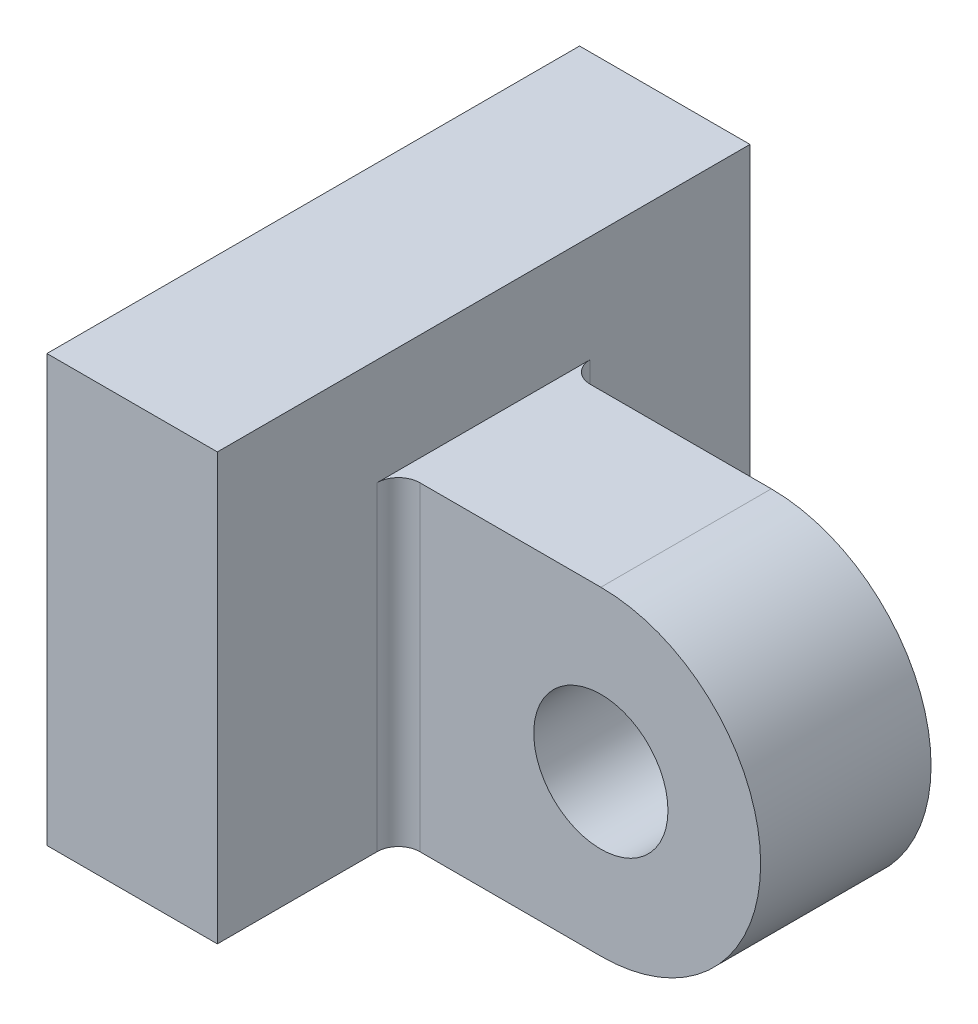
ISO-10303-21;
HEADER;
FILE_DESCRIPTION(('STEP AP214'),'2;1');
FILE_NAME('part.step','',(''),(''),'','','');
FILE_SCHEMA(('AUTOMOTIVE_DESIGN { 1 0 10303 214 1 1 1 1 }'));
ENDSEC;
DATA;
#1=APPLICATION_CONTEXT('core data for automotive mechanical design processes');
#2=APPLICATION_PROTOCOL_DEFINITION('international standard','automotive_design',2000,#1);
#3=PRODUCT_CONTEXT('',#1,'mechanical');
#4=PRODUCT('Part','Part','',(#3));
#5=PRODUCT_RELATED_PRODUCT_CATEGORY('part','',(#4));
#6=PRODUCT_DEFINITION_FORMATION('','',#4);
#7=PRODUCT_DEFINITION_CONTEXT('part definition',#1,'design');
#8=PRODUCT_DEFINITION('design','',#6,#7);
#9=PRODUCT_DEFINITION_SHAPE('','',#8);
#10=(LENGTH_UNIT() NAMED_UNIT(*) SI_UNIT(.MILLI.,.METRE.));
#11=(NAMED_UNIT(*) PLANE_ANGLE_UNIT() SI_UNIT($,.RADIAN.));
#12=(NAMED_UNIT(*) SI_UNIT($,.STERADIAN.) SOLID_ANGLE_UNIT());
#13=UNCERTAINTY_MEASURE_WITH_UNIT(LENGTH_MEASURE(1.E-05),#10,'distance_accuracy_value','');
#14=(GEOMETRIC_REPRESENTATION_CONTEXT(3) GLOBAL_UNCERTAINTY_ASSIGNED_CONTEXT((#13)) GLOBAL_UNIT_ASSIGNED_CONTEXT((#10,
#11,#12)) REPRESENTATION_CONTEXT('',''));
#15=CARTESIAN_POINT('',(0.,0.,0.));
#16=DIRECTION('',(0.,0.,1.));
#17=DIRECTION('',(1.,0.,0.));
#18=AXIS2_PLACEMENT_3D('',#15,#16,#17);
#19=CARTESIAN_POINT('',(22.9128784747792,-10.3877164770044,8.));
#20=DIRECTION('',(0.,0.,1.));
#21=DIRECTION('',(1.,0.,0.));
#22=AXIS2_PLACEMENT_3D('',#19,#20,#21);
#23=PLANE('',#22);
#24=CARTESIAN_POINT('',(22.9128784747792,-10.3877164770044,8.));
#25=DIRECTION('',(0.,0.,1.));
#26=DIRECTION('',(1.,0.,0.));
#27=AXIS2_PLACEMENT_3D('',#24,#25,#26);
#28=CIRCLE('',#27,3.15);
#29=CARTESIAN_POINT('',(26.0628784747792,-10.3877164770044,8.));
#30=VERTEX_POINT('',#29);
#31=EDGE_CURVE('E175',#30,#30,#28,.T.);
#32=ORIENTED_EDGE('',*,*,#31,.F.);
#33=EDGE_LOOP('',(#32));
#34=FACE_BOUND('',#33,.T.);
#35=DIRECTION('',(-1.,0.,0.));
#36=VECTOR('',#35,1.);
#37=CARTESIAN_POINT('',(22.9128784747792,-2.88771647700438,8.));
#38=LINE('',#37,#36);
#39=CARTESIAN_POINT('',(22.9128784747792,-2.88771647700438,8.));
#40=VERTEX_POINT('',#39);
#41=CARTESIAN_POINT('',(14.4128784747792,-2.88771647700438,8.));
#42=VERTEX_POINT('',#41);
#43=EDGE_CURVE('E187',#40,#42,#38,.T.);
#44=ORIENTED_EDGE('',*,*,#43,.T.);
#45=DIRECTION('',(0.,-1.,0.));
#46=VECTOR('',#45,1.);
#47=CARTESIAN_POINT('',(14.4128784747792,-10.3877164770044,8.));
#48=LINE('',#47,#46);
#49=CARTESIAN_POINT('',(14.4128784747792,-17.8877164770044,8.));
#50=VERTEX_POINT('',#49);
#51=EDGE_CURVE('E222',#42,#50,#48,.T.);
#52=ORIENTED_EDGE('',*,*,#51,.T.);
#53=DIRECTION('',(1.,0.,0.));
#54=VECTOR('',#53,1.);
#55=CARTESIAN_POINT('',(22.9128784747792,-17.8877164770044,8.));
#56=LINE('',#55,#54);
#57=CARTESIAN_POINT('',(22.9128784747792,-17.8877164770044,8.));
#58=VERTEX_POINT('',#57);
#59=EDGE_CURVE('E191',#50,#58,#56,.T.);
#60=ORIENTED_EDGE('',*,*,#59,.T.);
#61=CARTESIAN_POINT('',(22.9128784747792,-10.3877164770044,8.));
#62=DIRECTION('',(0.,0.,1.));
#63=DIRECTION('',(1.,0.,0.));
#64=AXIS2_PLACEMENT_3D('',#61,#62,#63);
#65=CIRCLE('',#64,7.5);
#66=EDGE_CURVE('E183',#58,#40,#65,.T.);
#67=ORIENTED_EDGE('',*,*,#66,.T.);
#68=EDGE_LOOP('',(#44,#52,#60,#67));
#69=FACE_BOUND('',#68,.T.);
#70=ADVANCED_FACE('F39',(#34,#69),#23,.T.);
#71=CARTESIAN_POINT('',(22.9128784747792,-10.3877164770044,0.));
#72=DIRECTION('',(0.,0.,1.));
#73=DIRECTION('',(1.,0.,0.));
#74=AXIS2_PLACEMENT_3D('',#71,#72,#73);
#75=PLANE('',#74);
#76=CARTESIAN_POINT('',(22.9128784747792,-10.3877164770044,0.));
#77=DIRECTION('',(0.,0.,1.));
#78=DIRECTION('',(1.,0.,0.));
#79=AXIS2_PLACEMENT_3D('',#76,#77,#78);
#80=CIRCLE('',#79,3.15);
#81=CARTESIAN_POINT('',(26.0628784747792,-10.3877164770044,0.));
#82=VERTEX_POINT('',#81);
#83=EDGE_CURVE('E174',#82,#82,#80,.T.);
#84=ORIENTED_EDGE('',*,*,#83,.T.);
#85=EDGE_LOOP('',(#84));
#86=FACE_BOUND('',#85,.T.);
#87=DIRECTION('',(1.,0.,0.));
#88=VECTOR('',#87,1.);
#89=CARTESIAN_POINT('',(22.9128784747792,-17.8877164770044,0.));
#90=LINE('',#89,#88);
#91=CARTESIAN_POINT('',(14.4128784747792,-17.8877164770044,0.));
#92=VERTEX_POINT('',#91);
#93=CARTESIAN_POINT('',(22.9128784747792,-17.8877164770044,0.));
#94=VERTEX_POINT('',#93);
#95=EDGE_CURVE('E188',#92,#94,#90,.T.);
#96=ORIENTED_EDGE('',*,*,#95,.F.);
#97=DIRECTION('',(0.,-1.,0.));
#98=VECTOR('',#97,1.);
#99=CARTESIAN_POINT('',(14.4128784747792,-2.88771647700438,0.));
#100=LINE('',#99,#98);
#101=CARTESIAN_POINT('',(14.4128784747792,-2.88771647700438,0.));
#102=VERTEX_POINT('',#101);
#103=EDGE_CURVE('E219',#92,#102,#100,.F.);
#104=ORIENTED_EDGE('',*,*,#103,.T.);
#105=DIRECTION('',(-1.,0.,0.));
#106=VECTOR('',#105,1.);
#107=CARTESIAN_POINT('',(22.9128784747792,-2.88771647700438,0.));
#108=LINE('',#107,#106);
#109=CARTESIAN_POINT('',(22.9128784747792,-2.88771647700438,0.));
#110=VERTEX_POINT('',#109);
#111=EDGE_CURVE('E198',#110,#102,#108,.T.);
#112=ORIENTED_EDGE('',*,*,#111,.F.);
#113=CARTESIAN_POINT('',(22.9128784747792,-10.3877164770044,0.));
#114=DIRECTION('',(0.,0.,1.));
#115=DIRECTION('',(1.,0.,0.));
#116=AXIS2_PLACEMENT_3D('',#113,#114,#115);
#117=CIRCLE('',#116,7.5);
#118=EDGE_CURVE('E179',#94,#110,#117,.T.);
#119=ORIENTED_EDGE('',*,*,#118,.F.);
#120=EDGE_LOOP('',(#96,#104,#112,#119));
#121=FACE_BOUND('',#120,.T.);
#122=ADVANCED_FACE('F247',(#86,#121),#75,.F.);
#123=CARTESIAN_POINT('',(22.9128784747792,-2.88771647700438,8.));
#124=DIRECTION('',(0.,-1.,0.));
#125=DIRECTION('',(1.,0.,0.));
#126=AXIS2_PLACEMENT_3D('',#123,#124,#125);
#127=PLANE('',#126);
#128=DIRECTION('',(0.,0.,-1.));
#129=VECTOR('',#128,1.);
#130=CARTESIAN_POINT('',(13.4128784747792,-2.88771647700438,8.));
#131=LINE('',#130,#129);
#132=CARTESIAN_POINT('',(13.4128784747792,-2.88771647700438,9.));
#133=VERTEX_POINT('',#132);
#134=CARTESIAN_POINT('',(13.4128784747792,-2.88771647700438,-1.));
#135=VERTEX_POINT('',#134);
#136=EDGE_CURVE('E166',#133,#135,#131,.T.);
#137=ORIENTED_EDGE('',*,*,#136,.F.);
#138=CARTESIAN_POINT('',(14.4128784747792,-2.88771647700438,9.));
#139=DIRECTION('',(0.,-1.,0.));
#140=DIRECTION('',(1.,0.,0.));
#141=AXIS2_PLACEMENT_3D('',#138,#139,#140);
#142=CIRCLE('',#141,1.);
#143=EDGE_CURVE('E11',#133,#42,#142,.T.);
#144=ORIENTED_EDGE('',*,*,#143,.T.);
#145=ORIENTED_EDGE('',*,*,#43,.F.);
#146=DIRECTION('',(0.,0.,-1.));
#147=VECTOR('',#146,1.);
#148=CARTESIAN_POINT('',(22.9128784747792,-2.88771647700438,8.));
#149=LINE('',#148,#147);
#150=EDGE_CURVE('E209',#40,#110,#149,.T.);
#151=ORIENTED_EDGE('',*,*,#150,.T.);
#152=ORIENTED_EDGE('',*,*,#111,.T.);
#153=CARTESIAN_POINT('',(14.4128784747792,-2.88771647700438,-1.));
#154=DIRECTION('',(0.,-1.,0.));
#155=DIRECTION('',(1.,0.,0.));
#156=AXIS2_PLACEMENT_3D('',#153,#154,#155);
#157=CIRCLE('',#156,1.);
#158=EDGE_CURVE('E228',#102,#135,#157,.T.);
#159=ORIENTED_EDGE('',*,*,#158,.T.);
#160=EDGE_LOOP('',(#137,#144,#145,#151,#152,#159));
#161=FACE_BOUND('',#160,.T.);
#162=ADVANCED_FACE('F240',(#161),#127,.F.);
#163=CARTESIAN_POINT('',(22.9128784747792,-10.3877164770044,8.));
#164=DIRECTION('',(0.,0.,-1.));
#165=DIRECTION('',(-1.,0.,0.));
#166=AXIS2_PLACEMENT_3D('',#163,#164,#165);
#167=CYLINDRICAL_SURFACE('',#166,7.5);
#168=ORIENTED_EDGE('',*,*,#118,.T.);
#169=ORIENTED_EDGE('',*,*,#150,.F.);
#170=ORIENTED_EDGE('',*,*,#66,.F.);
#171=DIRECTION('',(0.,0.,-1.));
#172=VECTOR('',#171,1.);
#173=CARTESIAN_POINT('',(22.9128784747792,-17.8877164770044,8.));
#174=LINE('',#173,#172);
#175=EDGE_CURVE('E194',#58,#94,#174,.T.);
#176=ORIENTED_EDGE('',*,*,#175,.T.);
#177=EDGE_LOOP('',(#168,#169,#170,#176));
#178=FACE_BOUND('',#177,.T.);
#179=ADVANCED_FACE('F244',(#178),#167,.T.);
#180=CARTESIAN_POINT('',(5.4128784747792,-2.88771647700438,8.));
#181=DIRECTION('',(1.,0.,0.));
#182=DIRECTION('',(0.,1.,0.));
#183=AXIS2_PLACEMENT_3D('',#180,#181,#182);
#184=PLANE('',#183);
#185=DIRECTION('',(0.,0.,-1.));
#186=VECTOR('',#185,1.);
#187=CARTESIAN_POINT('',(5.41287847477921,-17.8877164770044,8.));
#188=LINE('',#187,#186);
#189=CARTESIAN_POINT('',(5.4128784747792,-17.8877164770044,16.5));
#190=VERTEX_POINT('',#189);
#191=CARTESIAN_POINT('',(5.4128784747792,-17.8877164770044,-8.5));
#192=VERTEX_POINT('',#191);
#193=EDGE_CURVE('E120',#190,#192,#188,.T.);
#194=ORIENTED_EDGE('',*,*,#193,.F.);
#195=DIRECTION('',(0.,1.,0.));
#196=VECTOR('',#195,1.);
#197=CARTESIAN_POINT('',(5.4128784747792,2.11228352299562,16.5));
#198=LINE('',#197,#196);
#199=CARTESIAN_POINT('',(5.4128784747792,2.11228352299562,16.5));
#200=VERTEX_POINT('',#199);
#201=EDGE_CURVE('E150',#190,#200,#198,.T.);
#202=ORIENTED_EDGE('',*,*,#201,.T.);
#203=DIRECTION('',(0.,0.,-1.));
#204=VECTOR('',#203,1.);
#205=CARTESIAN_POINT('',(5.4128784747792,2.11228352299561,-8.5));
#206=LINE('',#205,#204);
#207=CARTESIAN_POINT('',(5.4128784747792,2.11228352299561,-8.5));
#208=VERTEX_POINT('',#207);
#209=EDGE_CURVE('E145',#200,#208,#206,.T.);
#210=ORIENTED_EDGE('',*,*,#209,.T.);
#211=DIRECTION('',(0.,-1.,0.));
#212=VECTOR('',#211,1.);
#213=CARTESIAN_POINT('',(5.4128784747792,2.11228352299561,-8.5));
#214=LINE('',#213,#212);
#215=EDGE_CURVE('E158',#208,#192,#214,.T.);
#216=ORIENTED_EDGE('',*,*,#215,.T.);
#217=EDGE_LOOP('',(#194,#202,#210,#216));
#218=FACE_BOUND('',#217,.T.);
#219=ADVANCED_FACE('F274',(#218),#184,.F.);
#220=CARTESIAN_POINT('',(22.9128784747792,-17.8877164770044,8.));
#221=DIRECTION('',(0.,1.,0.));
#222=DIRECTION('',(-1.,0.,0.));
#223=AXIS2_PLACEMENT_3D('',#220,#221,#222);
#224=PLANE('',#223);
#225=ORIENTED_EDGE('',*,*,#193,.T.);
#226=DIRECTION('',(-1.,0.,0.));
#227=VECTOR('',#226,1.);
#228=CARTESIAN_POINT('',(13.4128784747792,-17.8877164770044,-8.5));
#229=LINE('',#228,#227);
#230=CARTESIAN_POINT('',(13.4128784747792,-17.8877164770044,-8.5));
#231=VERTEX_POINT('',#230);
#232=EDGE_CURVE('E115',#231,#192,#229,.T.);
#233=ORIENTED_EDGE('',*,*,#232,.F.);
#234=DIRECTION('',(0.,0.,1.));
#235=VECTOR('',#234,1.);
#236=CARTESIAN_POINT('',(13.4128784747792,-17.8877164770044,-8.5));
#237=LINE('',#236,#235);
#238=CARTESIAN_POINT('',(13.4128784747792,-17.8877164770044,-1.));
#239=VERTEX_POINT('',#238);
#240=EDGE_CURVE('E118',#231,#239,#237,.T.);
#241=ORIENTED_EDGE('',*,*,#240,.T.);
#242=CARTESIAN_POINT('',(14.4128784747792,-17.8877164770044,-1.));
#243=DIRECTION('',(0.,1.,0.));
#244=DIRECTION('',(-1.,0.,0.));
#245=AXIS2_PLACEMENT_3D('',#242,#243,#244);
#246=CIRCLE('',#245,1.);
#247=EDGE_CURVE('E225',#239,#92,#246,.T.);
#248=ORIENTED_EDGE('',*,*,#247,.T.);
#249=ORIENTED_EDGE('',*,*,#95,.T.);
#250=ORIENTED_EDGE('',*,*,#175,.F.);
#251=ORIENTED_EDGE('',*,*,#59,.F.);
#252=CARTESIAN_POINT('',(14.4128784747792,-17.8877164770044,9.));
#253=DIRECTION('',(0.,1.,0.));
#254=DIRECTION('',(-1.,0.,0.));
#255=AXIS2_PLACEMENT_3D('',#252,#253,#254);
#256=CIRCLE('',#255,1.);
#257=CARTESIAN_POINT('',(13.4128784747792,-17.8877164770044,9.));
#258=VERTEX_POINT('',#257);
#259=EDGE_CURVE('E48',#50,#258,#256,.T.);
#260=ORIENTED_EDGE('',*,*,#259,.T.);
#261=CARTESIAN_POINT('',(13.4128784747792,-17.8877164770044,16.5));
#262=VERTEX_POINT('',#261);
#263=EDGE_CURVE('E140',#258,#262,#237,.T.);
#264=ORIENTED_EDGE('',*,*,#263,.T.);
#265=DIRECTION('',(-1.,0.,0.));
#266=VECTOR('',#265,1.);
#267=CARTESIAN_POINT('',(13.4128784747792,-17.8877164770044,16.5));
#268=LINE('',#267,#266);
#269=EDGE_CURVE('E126',#262,#190,#268,.T.);
#270=ORIENTED_EDGE('',*,*,#269,.T.);
#271=EDGE_LOOP('',(#225,#233,#241,#248,#249,#250,#251,#260,#264,#270));
#272=FACE_BOUND('',#271,.T.);
#273=ADVANCED_FACE('F117',(#272),#224,.F.);
#274=CARTESIAN_POINT('',(22.9128784747792,-10.3877164770044,8.));
#275=DIRECTION('',(0.,0.,-1.));
#276=DIRECTION('',(-1.,0.,0.));
#277=AXIS2_PLACEMENT_3D('',#274,#275,#276);
#278=CYLINDRICAL_SURFACE('',#277,3.15);
#279=ORIENTED_EDGE('',*,*,#31,.T.);
#280=EDGE_LOOP('',(#279));
#281=FACE_BOUND('',#280,.T.);
#282=ORIENTED_EDGE('',*,*,#83,.F.);
#283=EDGE_LOOP('',(#282));
#284=FACE_BOUND('',#283,.T.);
#285=ADVANCED_FACE('F269',(#281,#284),#278,.F.);
#286=CARTESIAN_POINT('',(13.4128784747792,2.11228352299561,-8.5));
#287=DIRECTION('',(0.,0.,-1.));
#288=DIRECTION('',(0.,1.,0.));
#289=AXIS2_PLACEMENT_3D('',#286,#287,#288);
#290=PLANE('',#289);
#291=ORIENTED_EDGE('',*,*,#215,.F.);
#292=DIRECTION('',(-1.,0.,0.));
#293=VECTOR('',#292,1.);
#294=CARTESIAN_POINT('',(13.4128784747792,2.11228352299561,-8.5));
#295=LINE('',#294,#293);
#296=CARTESIAN_POINT('',(13.4128784747792,2.11228352299561,-8.5));
#297=VERTEX_POINT('',#296);
#298=EDGE_CURVE('E143',#297,#208,#295,.T.);
#299=ORIENTED_EDGE('',*,*,#298,.F.);
#300=DIRECTION('',(0.,-1.,0.));
#301=VECTOR('',#300,1.);
#302=CARTESIAN_POINT('',(13.4128784747792,2.11228352299561,-8.5));
#303=LINE('',#302,#301);
#304=EDGE_CURVE('E134',#297,#231,#303,.T.);
#305=ORIENTED_EDGE('',*,*,#304,.T.);
#306=ORIENTED_EDGE('',*,*,#232,.T.);
#307=EDGE_LOOP('',(#291,#299,#305,#306));
#308=FACE_BOUND('',#307,.T.);
#309=ADVANCED_FACE('F142',(#308),#290,.T.);
#310=CARTESIAN_POINT('',(13.4128784747792,2.11228352299561,-8.5));
#311=DIRECTION('',(0.,1.,0.));
#312=DIRECTION('',(0.,0.,1.));
#313=AXIS2_PLACEMENT_3D('',#310,#311,#312);
#314=PLANE('',#313);
#315=ORIENTED_EDGE('',*,*,#209,.F.);
#316=DIRECTION('',(-1.,0.,0.));
#317=VECTOR('',#316,1.);
#318=CARTESIAN_POINT('',(13.4128784747792,2.11228352299562,16.5));
#319=LINE('',#318,#317);
#320=CARTESIAN_POINT('',(13.4128784747792,2.11228352299562,16.5));
#321=VERTEX_POINT('',#320);
#322=EDGE_CURVE('E167',#321,#200,#319,.T.);
#323=ORIENTED_EDGE('',*,*,#322,.F.);
#324=DIRECTION('',(0.,0.,-1.));
#325=VECTOR('',#324,1.);
#326=CARTESIAN_POINT('',(13.4128784747792,2.11228352299561,-8.5));
#327=LINE('',#326,#325);
#328=EDGE_CURVE('E127',#321,#297,#327,.T.);
#329=ORIENTED_EDGE('',*,*,#328,.T.);
#330=ORIENTED_EDGE('',*,*,#298,.T.);
#331=EDGE_LOOP('',(#315,#323,#329,#330));
#332=FACE_BOUND('',#331,.T.);
#333=ADVANCED_FACE('F305',(#332),#314,.T.);
#334=CARTESIAN_POINT('',(13.4128784747792,2.11228352299562,16.5));
#335=DIRECTION('',(0.,0.,1.));
#336=DIRECTION('',(0.,-1.,0.));
#337=AXIS2_PLACEMENT_3D('',#334,#335,#336);
#338=PLANE('',#337);
#339=ORIENTED_EDGE('',*,*,#201,.F.);
#340=ORIENTED_EDGE('',*,*,#269,.F.);
#341=DIRECTION('',(0.,1.,0.));
#342=VECTOR('',#341,1.);
#343=CARTESIAN_POINT('',(13.4128784747792,2.11228352299562,16.5));
#344=LINE('',#343,#342);
#345=EDGE_CURVE('E139',#262,#321,#344,.T.);
#346=ORIENTED_EDGE('',*,*,#345,.T.);
#347=ORIENTED_EDGE('',*,*,#322,.T.);
#348=EDGE_LOOP('',(#339,#340,#346,#347));
#349=FACE_BOUND('',#348,.T.);
#350=ADVANCED_FACE('F256',(#349),#338,.T.);
#351=CARTESIAN_POINT('',(13.4128784747792,0.,0.));
#352=DIRECTION('',(-1.,0.,0.));
#353=DIRECTION('',(0.,-1.,0.));
#354=AXIS2_PLACEMENT_3D('',#351,#352,#353);
#355=PLANE('',#354);
#356=ORIENTED_EDGE('',*,*,#136,.T.);
#357=DIRECTION('',(0.,-1.,0.));
#358=VECTOR('',#357,1.);
#359=CARTESIAN_POINT('',(13.4128784747792,-17.8877164770044,-1.));
#360=LINE('',#359,#358);
#361=EDGE_CURVE('E137',#135,#239,#360,.T.);
#362=ORIENTED_EDGE('',*,*,#361,.T.);
#363=ORIENTED_EDGE('',*,*,#240,.F.);
#364=ORIENTED_EDGE('',*,*,#304,.F.);
#365=ORIENTED_EDGE('',*,*,#328,.F.);
#366=ORIENTED_EDGE('',*,*,#345,.F.);
#367=ORIENTED_EDGE('',*,*,#263,.F.);
#368=DIRECTION('',(0.,-1.,0.));
#369=VECTOR('',#368,1.);
#370=CARTESIAN_POINT('',(13.4128784747792,0.,9.));
#371=LINE('',#370,#369);
#372=EDGE_CURVE('E213',#258,#133,#371,.F.);
#373=ORIENTED_EDGE('',*,*,#372,.T.);
#374=EDGE_LOOP('',(#356,#362,#363,#364,#365,#366,#367,#373));
#375=FACE_BOUND('',#374,.T.);
#376=ADVANCED_FACE('F132',(#375),#355,.F.);
#377=CARTESIAN_POINT('',(14.4128784747792,0.,-1.));
#378=DIRECTION('',(0.,1.,0.));
#379=DIRECTION('',(-1.,0.,0.));
#380=AXIS2_PLACEMENT_3D('',#377,#378,#379);
#381=CYLINDRICAL_SURFACE('',#380,1.);
#382=ORIENTED_EDGE('',*,*,#158,.F.);
#383=ORIENTED_EDGE('',*,*,#103,.F.);
#384=ORIENTED_EDGE('',*,*,#247,.F.);
#385=ORIENTED_EDGE('',*,*,#361,.F.);
#386=EDGE_LOOP('',(#382,#383,#384,#385));
#387=FACE_BOUND('',#386,.T.);
#388=ADVANCED_FACE('F250',(#387),#381,.F.);
#389=CARTESIAN_POINT('',(14.4128784747792,-10.3877164770044,9.));
#390=DIRECTION('',(0.,-1.,0.));
#391=DIRECTION('',(1.,0.,0.));
#392=AXIS2_PLACEMENT_3D('',#389,#390,#391);
#393=CYLINDRICAL_SURFACE('',#392,1.);
#394=ORIENTED_EDGE('',*,*,#143,.F.);
#395=ORIENTED_EDGE('',*,*,#372,.F.);
#396=ORIENTED_EDGE('',*,*,#259,.F.);
#397=ORIENTED_EDGE('',*,*,#51,.F.);
#398=EDGE_LOOP('',(#394,#395,#396,#397));
#399=FACE_BOUND('',#398,.T.);
#400=ADVANCED_FACE('F41',(#399),#393,.F.);
#401=CLOSED_SHELL('',(#70,#122,#162,#179,#219,#273,#285,#309,#333,#350,#376,#388,#400));
#402=MANIFOLD_SOLID_BREP('B2',#401);
#403=ADVANCED_BREP_SHAPE_REPRESENTATION('',(#18,#402),#14);
#404=SHAPE_DEFINITION_REPRESENTATION(#9,#403);
ENDSEC;
END-ISO-10303-21;
